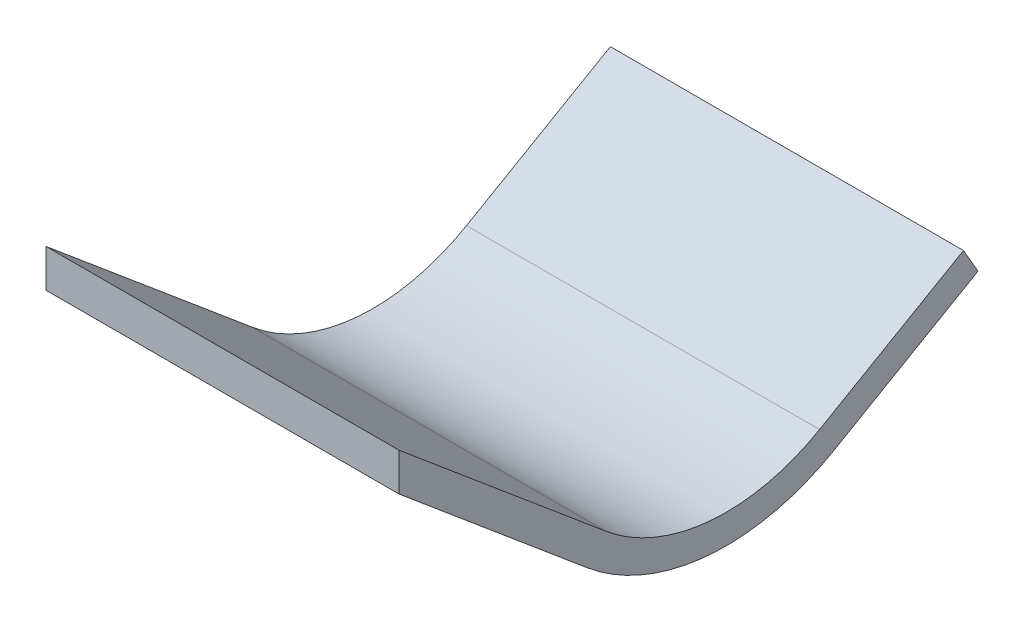
ISO-10303-21;
HEADER;
FILE_DESCRIPTION(('STEP AP214'),'2;1');
FILE_NAME('part.step','',(''),(''),'','','');
FILE_SCHEMA(('AUTOMOTIVE_DESIGN { 1 0 10303 214 1 1 1 1 }'));
ENDSEC;
DATA;
#1=APPLICATION_CONTEXT('core data for automotive mechanical design processes');
#2=APPLICATION_PROTOCOL_DEFINITION('international standard','automotive_design',2000,#1);
#3=PRODUCT_CONTEXT('',#1,'mechanical');
#4=PRODUCT('Part','Part','',(#3));
#5=PRODUCT_RELATED_PRODUCT_CATEGORY('part','',(#4));
#6=PRODUCT_DEFINITION_FORMATION('','',#4);
#7=PRODUCT_DEFINITION_CONTEXT('part definition',#1,'design');
#8=PRODUCT_DEFINITION('design','',#6,#7);
#9=PRODUCT_DEFINITION_SHAPE('','',#8);
#10=(LENGTH_UNIT() NAMED_UNIT(*) SI_UNIT(.MILLI.,.METRE.));
#11=(NAMED_UNIT(*) PLANE_ANGLE_UNIT() SI_UNIT($,.RADIAN.));
#12=(NAMED_UNIT(*) SI_UNIT($,.STERADIAN.) SOLID_ANGLE_UNIT());
#13=UNCERTAINTY_MEASURE_WITH_UNIT(LENGTH_MEASURE(1.E-05),#10,'distance_accuracy_value','');
#14=(GEOMETRIC_REPRESENTATION_CONTEXT(3) GLOBAL_UNCERTAINTY_ASSIGNED_CONTEXT((#13)) GLOBAL_UNIT_ASSIGNED_CONTEXT((#10,
#11,#12)) REPRESENTATION_CONTEXT('',''));
#15=CARTESIAN_POINT('',(0.,0.,0.));
#16=DIRECTION('',(0.,0.,1.));
#17=DIRECTION('',(1.,0.,0.));
#18=AXIS2_PLACEMENT_3D('',#15,#16,#17);
#19=CARTESIAN_POINT('',(85.,10.2394798378894,72.0408871189236));
#20=DIRECTION('',(0.,0.,-1.));
#21=DIRECTION('',(-1.,0.,0.));
#22=AXIS2_PLACEMENT_3D('',#19,#20,#21);
#23=PLANE('',#22);
#24=DIRECTION('',(0.,-1.,0.));
#25=VECTOR('',#24,1.);
#26=CARTESIAN_POINT('',(0.,10.2394798378894,72.0408871189236));
#27=LINE('',#26,#25);
#28=CARTESIAN_POINT('',(0.,10.2394798378894,72.0408871189236));
#29=VERTEX_POINT('',#28);
#30=CARTESIAN_POINT('',(0.,1.10153213362419,72.0408871189236));
#31=VERTEX_POINT('',#30);
#32=EDGE_CURVE('E139',#29,#31,#27,.T.);
#33=ORIENTED_EDGE('',*,*,#32,.T.);
#34=DIRECTION('',(-1.,0.,0.));
#35=VECTOR('',#34,1.);
#36=CARTESIAN_POINT('',(85.,1.10153213362419,72.0408871189236));
#37=LINE('',#36,#35);
#38=CARTESIAN_POINT('',(85.,1.10153213362419,72.0408871189236));
#39=VERTEX_POINT('',#38);
#40=EDGE_CURVE('E11',#39,#31,#37,.T.);
#41=ORIENTED_EDGE('',*,*,#40,.F.);
#42=DIRECTION('',(0.,-1.,0.));
#43=VECTOR('',#42,1.);
#44=CARTESIAN_POINT('',(85.,10.2394798378894,72.0408871189236));
#45=LINE('',#44,#43);
#46=CARTESIAN_POINT('',(85.,10.2394798378894,72.0408871189236));
#47=VERTEX_POINT('',#46);
#48=EDGE_CURVE('E153',#47,#39,#45,.T.);
#49=ORIENTED_EDGE('',*,*,#48,.F.);
#50=DIRECTION('',(-1.,0.,0.));
#51=VECTOR('',#50,1.);
#52=CARTESIAN_POINT('',(85.,10.2394798378894,72.0408871189236));
#53=LINE('',#52,#51);
#54=EDGE_CURVE('E135',#47,#29,#53,.T.);
#55=ORIENTED_EDGE('',*,*,#54,.T.);
#56=EDGE_LOOP('',(#33,#41,#49,#55));
#57=FACE_BOUND('',#56,.T.);
#58=ADVANCED_FACE('F43',(#57),#23,.F.);
#59=CARTESIAN_POINT('',(85.,1.10153213362419,72.0408871189236));
#60=DIRECTION('',(0.,0.766036338414662,-0.642797268373363));
#61=DIRECTION('',(0.,0.642797268373363,0.766036338414662));
#62=AXIS2_PLACEMENT_3D('',#59,#60,#61);
#63=PLANE('',#62);
#64=DIRECTION('',(0.,-0.642797268373363,-0.766036338414662));
#65=VECTOR('',#64,1.);
#66=CARTESIAN_POINT('',(0.,1.10153213362419,72.0408871189236));
#67=LINE('',#66,#65);
#68=CARTESIAN_POINT('',(0.,-36.9045969752818,26.7481060005841));
#69=VERTEX_POINT('',#68);
#70=EDGE_CURVE('E142',#31,#69,#67,.T.);
#71=ORIENTED_EDGE('',*,*,#70,.T.);
#72=DIRECTION('',(-1.,0.,0.));
#73=VECTOR('',#72,1.);
#74=CARTESIAN_POINT('',(85.,-36.9045969752818,26.7481060005841));
#75=LINE('',#74,#73);
#76=CARTESIAN_POINT('',(85.,-36.9045969752818,26.7481060005841));
#77=VERTEX_POINT('',#76);
#78=EDGE_CURVE('E51',#77,#69,#75,.T.);
#79=ORIENTED_EDGE('',*,*,#78,.F.);
#80=DIRECTION('',(0.,-0.642797268373363,-0.766036338414662));
#81=VECTOR('',#80,1.);
#82=CARTESIAN_POINT('',(85.,1.10153213362419,72.0408871189236));
#83=LINE('',#82,#81);
#84=EDGE_CURVE('E102',#39,#77,#83,.T.);
#85=ORIENTED_EDGE('',*,*,#84,.F.);
#86=ORIENTED_EDGE('',*,*,#40,.T.);
#87=EDGE_LOOP('',(#71,#79,#85,#86));
#88=FACE_BOUND('',#87,.T.);
#89=ADVANCED_FACE('F188',(#88),#63,.F.);
#90=CARTESIAN_POINT('',(85.,2.92929262228063,-6.67735195483076));
#91=DIRECTION('',(-1.,0.,0.));
#92=DIRECTION('',(0.,0.,1.));
#93=AXIS2_PLACEMENT_3D('',#90,#91,#92);
#94=CYLINDRICAL_SURFACE('',#93,52.);
#95=CARTESIAN_POINT('',(0.,2.92929262228063,-6.67735195483076));
#96=DIRECTION('',(1.,0.,0.));
#97=DIRECTION('',(0.,0.,-1.));
#98=AXIS2_PLACEMENT_3D('',#95,#96,#97);
#99=CIRCLE('',#98,52.);
#100=CARTESIAN_POINT('',(0.,-42.1043561941894,-32.6767841462237));
#101=VERTEX_POINT('',#100);
#102=EDGE_CURVE('E144',#69,#101,#99,.T.);
#103=ORIENTED_EDGE('',*,*,#102,.T.);
#104=DIRECTION('',(-1.,0.,0.));
#105=VECTOR('',#104,1.);
#106=CARTESIAN_POINT('',(85.,-42.1043561941894,-32.6767841462237));
#107=LINE('',#106,#105);
#108=CARTESIAN_POINT('',(85.,-42.1043561941894,-32.6767841462237));
#109=VERTEX_POINT('',#108);
#110=EDGE_CURVE('E160',#109,#101,#107,.T.);
#111=ORIENTED_EDGE('',*,*,#110,.F.);
#112=CARTESIAN_POINT('',(85.,2.92929262228063,-6.67735195483076));
#113=DIRECTION('',(1.,0.,0.));
#114=DIRECTION('',(0.,0.,-1.));
#115=AXIS2_PLACEMENT_3D('',#112,#113,#114);
#116=CIRCLE('',#115,52.);
#117=EDGE_CURVE('E168',#77,#109,#116,.T.);
#118=ORIENTED_EDGE('',*,*,#117,.F.);
#119=ORIENTED_EDGE('',*,*,#78,.T.);
#120=EDGE_LOOP('',(#103,#111,#118,#119));
#121=FACE_BOUND('',#120,.T.);
#122=ADVANCED_FACE('F166',(#121),#94,.T.);
#123=CARTESIAN_POINT('',(85.,-42.1043561941894,-32.6767841462237));
#124=DIRECTION('',(0.,0.86603170800904,0.499989080603711));
#125=DIRECTION('',(0.,-0.499989080603711,0.866031708009041));
#126=AXIS2_PLACEMENT_3D('',#123,#124,#125);
#127=PLANE('',#126);
#128=DIRECTION('',(0.,0.499989080603711,-0.86603170800904));
#129=VECTOR('',#128,1.);
#130=CARTESIAN_POINT('',(0.,-42.1043561941894,-32.6767841462237));
#131=LINE('',#130,#129);
#132=CARTESIAN_POINT('',(0.,-22.104792970041,-67.3180524665854));
#133=VERTEX_POINT('',#132);
#134=EDGE_CURVE('E146',#101,#133,#131,.T.);
#135=ORIENTED_EDGE('',*,*,#134,.T.);
#136=DIRECTION('',(-1.,0.,0.));
#137=VECTOR('',#136,1.);
#138=CARTESIAN_POINT('',(85.,-22.104792970041,-67.3180524665854));
#139=LINE('',#138,#137);
#140=CARTESIAN_POINT('',(85.,-22.104792970041,-67.3180524665854));
#141=VERTEX_POINT('',#140);
#142=EDGE_CURVE('E157',#141,#133,#139,.T.);
#143=ORIENTED_EDGE('',*,*,#142,.F.);
#144=DIRECTION('',(0.,0.499989080603711,-0.86603170800904));
#145=VECTOR('',#144,1.);
#146=CARTESIAN_POINT('',(85.,-42.1043561941894,-32.6767841462237));
#147=LINE('',#146,#145);
#148=EDGE_CURVE('E180',#109,#141,#147,.T.);
#149=ORIENTED_EDGE('',*,*,#148,.F.);
#150=ORIENTED_EDGE('',*,*,#110,.T.);
#151=EDGE_LOOP('',(#135,#143,#149,#150));
#152=FACE_BOUND('',#151,.T.);
#153=ADVANCED_FACE('F176',(#152),#127,.F.);
#154=CARTESIAN_POINT('',(85.,-16.0425710139777,-63.8181289023594));
#155=DIRECTION('',(0.,-0.499989080603712,0.86603170800904));
#156=DIRECTION('',(0.,-0.86603170800904,-0.499989080603712));
#157=AXIS2_PLACEMENT_3D('',#154,#155,#156);
#158=PLANE('',#157);
#159=DIRECTION('',(0.,0.86603170800904,0.499989080603712));
#160=VECTOR('',#159,1.);
#161=CARTESIAN_POINT('',(0.,-16.0425710139777,-63.8181289023594));
#162=LINE('',#161,#160);
#163=CARTESIAN_POINT('',(0.,-16.0425710139777,-63.8181289023594));
#164=VERTEX_POINT('',#163);
#165=EDGE_CURVE('E148',#133,#164,#162,.T.);
#166=ORIENTED_EDGE('',*,*,#165,.T.);
#167=DIRECTION('',(-1.,0.,0.));
#168=VECTOR('',#167,1.);
#169=CARTESIAN_POINT('',(85.,-16.0425710139777,-63.8181289023594));
#170=LINE('',#169,#168);
#171=CARTESIAN_POINT('',(85.,-16.0425710139777,-63.8181289023594));
#172=VERTEX_POINT('',#171);
#173=EDGE_CURVE('E130',#172,#164,#170,.T.);
#174=ORIENTED_EDGE('',*,*,#173,.F.);
#175=DIRECTION('',(0.,0.86603170800904,0.499989080603712));
#176=VECTOR('',#175,1.);
#177=CARTESIAN_POINT('',(85.,-16.0425710139777,-63.8181289023594));
#178=LINE('',#177,#176);
#179=EDGE_CURVE('E121',#141,#172,#178,.T.);
#180=ORIENTED_EDGE('',*,*,#179,.F.);
#181=ORIENTED_EDGE('',*,*,#142,.T.);
#182=EDGE_LOOP('',(#166,#174,#180,#181));
#183=FACE_BOUND('',#182,.T.);
#184=ADVANCED_FACE('F179',(#183),#158,.F.);
#185=CARTESIAN_POINT('',(85.,-36.0421342381262,-29.1768605819978));
#186=DIRECTION('',(0.,-0.86603170800904,-0.499989080603711));
#187=DIRECTION('',(0.,0.499989080603712,-0.86603170800904));
#188=AXIS2_PLACEMENT_3D('',#185,#186,#187);
#189=PLANE('',#188);
#190=DIRECTION('',(0.,-0.499989080603712,0.86603170800904));
#191=VECTOR('',#190,1.);
#192=CARTESIAN_POINT('',(0.,-36.0421342381262,-29.1768605819978));
#193=LINE('',#192,#191);
#194=CARTESIAN_POINT('',(0.,-36.0421342381262,-29.1768605819978));
#195=VERTEX_POINT('',#194);
#196=EDGE_CURVE('E129',#164,#195,#193,.T.);
#197=ORIENTED_EDGE('',*,*,#196,.T.);
#198=DIRECTION('',(-1.,0.,0.));
#199=VECTOR('',#198,1.);
#200=CARTESIAN_POINT('',(85.,-36.0421342381262,-29.1768605819978));
#201=LINE('',#200,#199);
#202=CARTESIAN_POINT('',(85.,-36.0421342381262,-29.1768605819978));
#203=VERTEX_POINT('',#202);
#204=EDGE_CURVE('E126',#203,#195,#201,.T.);
#205=ORIENTED_EDGE('',*,*,#204,.F.);
#206=DIRECTION('',(0.,-0.499989080603712,0.86603170800904));
#207=VECTOR('',#206,1.);
#208=CARTESIAN_POINT('',(85.,-36.0421342381262,-29.1768605819978));
#209=LINE('',#208,#207);
#210=EDGE_CURVE('E115',#172,#203,#209,.T.);
#211=ORIENTED_EDGE('',*,*,#210,.F.);
#212=ORIENTED_EDGE('',*,*,#173,.T.);
#213=EDGE_LOOP('',(#197,#205,#211,#212));
#214=FACE_BOUND('',#213,.T.);
#215=ADVANCED_FACE('F127',(#214),#189,.F.);
#216=CARTESIAN_POINT('',(85.,2.92929262228063,-6.67735195483076));
#217=DIRECTION('',(-1.,0.,0.));
#218=DIRECTION('',(0.,0.,1.));
#219=AXIS2_PLACEMENT_3D('',#216,#217,#218);
#220=CYLINDRICAL_SURFACE('',#219,45.);
#221=CARTESIAN_POINT('',(0.,2.92929262228063,-6.67735195483076));
#222=DIRECTION('',(-1.,0.,0.));
#223=DIRECTION('',(0.,0.,-1.));
#224=AXIS2_PLACEMENT_3D('',#221,#222,#223);
#225=CIRCLE('',#224,45.);
#226=CARTESIAN_POINT('',(0.,-31.5423426063792,22.2485251219706));
#227=VERTEX_POINT('',#226);
#228=EDGE_CURVE('E88',#195,#227,#225,.T.);
#229=ORIENTED_EDGE('',*,*,#228,.T.);
#230=DIRECTION('',(-1.,0.,0.));
#231=VECTOR('',#230,1.);
#232=CARTESIAN_POINT('',(85.,-31.5423426063792,22.2485251219706));
#233=LINE('',#232,#231);
#234=CARTESIAN_POINT('',(85.,-31.5423426063792,22.2485251219706));
#235=VERTEX_POINT('',#234);
#236=EDGE_CURVE('E131',#235,#227,#233,.T.);
#237=ORIENTED_EDGE('',*,*,#236,.F.);
#238=CARTESIAN_POINT('',(85.,2.92929262228063,-6.67735195483076));
#239=DIRECTION('',(-1.,0.,0.));
#240=DIRECTION('',(0.,0.,-1.));
#241=AXIS2_PLACEMENT_3D('',#238,#239,#240);
#242=CIRCLE('',#241,45.);
#243=EDGE_CURVE('E119',#203,#235,#242,.T.);
#244=ORIENTED_EDGE('',*,*,#243,.F.);
#245=ORIENTED_EDGE('',*,*,#204,.T.);
#246=EDGE_LOOP('',(#229,#237,#244,#245));
#247=FACE_BOUND('',#246,.T.);
#248=ADVANCED_FACE('F133',(#247),#220,.F.);
#249=CARTESIAN_POINT('',(85.,10.2394798378894,72.0408871189236));
#250=DIRECTION('',(0.,-0.766036338414662,0.642797268373363));
#251=DIRECTION('',(0.,-0.642797268373363,-0.766036338414662));
#252=AXIS2_PLACEMENT_3D('',#249,#250,#251);
#253=PLANE('',#252);
#254=DIRECTION('',(0.,0.642797268373363,0.766036338414662));
#255=VECTOR('',#254,1.);
#256=CARTESIAN_POINT('',(0.,10.2394798378894,72.0408871189236));
#257=LINE('',#256,#255);
#258=EDGE_CURVE('E94',#227,#29,#257,.T.);
#259=ORIENTED_EDGE('',*,*,#258,.T.);
#260=ORIENTED_EDGE('',*,*,#54,.F.);
#261=DIRECTION('',(0.,0.642797268373363,0.766036338414662));
#262=VECTOR('',#261,1.);
#263=CARTESIAN_POINT('',(85.,10.2394798378894,72.0408871189236));
#264=LINE('',#263,#262);
#265=EDGE_CURVE('E59',#235,#47,#264,.T.);
#266=ORIENTED_EDGE('',*,*,#265,.F.);
#267=ORIENTED_EDGE('',*,*,#236,.T.);
#268=EDGE_LOOP('',(#259,#260,#266,#267));
#269=FACE_BOUND('',#268,.T.);
#270=ADVANCED_FACE('F204',(#269),#253,.F.);
#271=CARTESIAN_POINT('',(85.,2.92929262228063,-6.67735195483076));
#272=DIRECTION('',(1.,0.,0.));
#273=DIRECTION('',(0.,0.,-1.));
#274=AXIS2_PLACEMENT_3D('',#271,#272,#273);
#275=PLANE('',#274);
#276=ORIENTED_EDGE('',*,*,#48,.T.);
#277=ORIENTED_EDGE('',*,*,#84,.T.);
#278=ORIENTED_EDGE('',*,*,#117,.T.);
#279=ORIENTED_EDGE('',*,*,#148,.T.);
#280=ORIENTED_EDGE('',*,*,#179,.T.);
#281=ORIENTED_EDGE('',*,*,#210,.T.);
#282=ORIENTED_EDGE('',*,*,#243,.T.);
#283=ORIENTED_EDGE('',*,*,#265,.T.);
#284=EDGE_LOOP('',(#276,#277,#278,#279,#280,#281,#282,#283));
#285=FACE_BOUND('',#284,.T.);
#286=ADVANCED_FACE('F117',(#285),#275,.T.);
#287=CARTESIAN_POINT('',(0.,2.92929262228063,-6.67735195483076));
#288=DIRECTION('',(1.,0.,0.));
#289=DIRECTION('',(0.,0.,-1.));
#290=AXIS2_PLACEMENT_3D('',#287,#288,#289);
#291=PLANE('',#290);
#292=ORIENTED_EDGE('',*,*,#32,.F.);
#293=ORIENTED_EDGE('',*,*,#258,.F.);
#294=ORIENTED_EDGE('',*,*,#228,.F.);
#295=ORIENTED_EDGE('',*,*,#196,.F.);
#296=ORIENTED_EDGE('',*,*,#165,.F.);
#297=ORIENTED_EDGE('',*,*,#134,.F.);
#298=ORIENTED_EDGE('',*,*,#102,.F.);
#299=ORIENTED_EDGE('',*,*,#70,.F.);
#300=EDGE_LOOP('',(#292,#293,#294,#295,#296,#297,#298,#299));
#301=FACE_BOUND('',#300,.T.);
#302=ADVANCED_FACE('F172',(#301),#291,.F.);
#303=CLOSED_SHELL('',(#58,#89,#122,#153,#184,#215,#248,#270,#286,#302));
#304=MANIFOLD_SOLID_BREP('B2',#303);
#305=ADVANCED_BREP_SHAPE_REPRESENTATION('',(#18,#304),#14);
#306=SHAPE_DEFINITION_REPRESENTATION(#9,#305);
ENDSEC;
END-ISO-10303-21;
